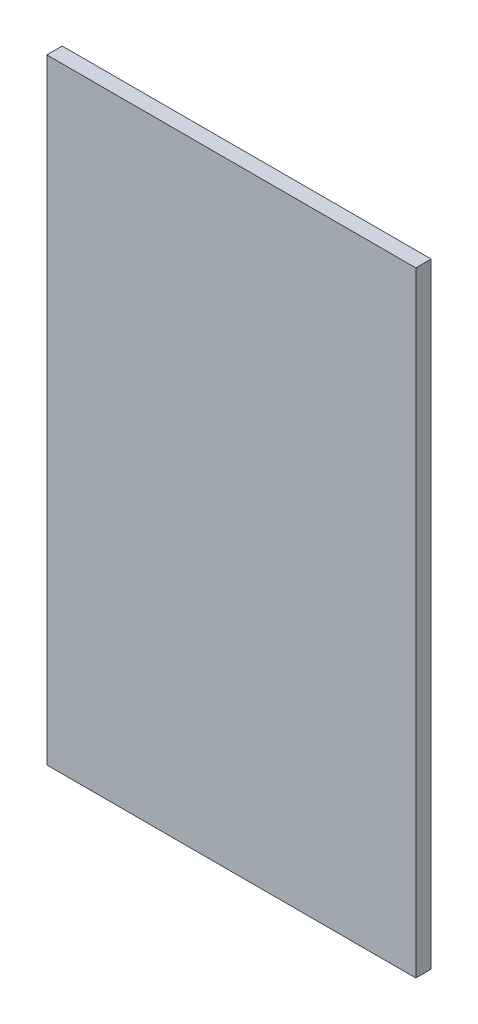
ISO-10303-21;
HEADER;
FILE_DESCRIPTION(('STEP AP214'),'2;1');
FILE_NAME('part.step','',(''),(''),'','','');
FILE_SCHEMA(('AUTOMOTIVE_DESIGN { 1 0 10303 214 1 1 1 1 }'));
ENDSEC;
DATA;
#1=APPLICATION_CONTEXT('core data for automotive mechanical design processes');
#2=APPLICATION_PROTOCOL_DEFINITION('international standard','automotive_design',2000,#1);
#3=PRODUCT_CONTEXT('',#1,'mechanical');
#4=PRODUCT('Part','Part','',(#3));
#5=PRODUCT_RELATED_PRODUCT_CATEGORY('part','',(#4));
#6=PRODUCT_DEFINITION_FORMATION('','',#4);
#7=PRODUCT_DEFINITION_CONTEXT('part definition',#1,'design');
#8=PRODUCT_DEFINITION('design','',#6,#7);
#9=PRODUCT_DEFINITION_SHAPE('','',#8);
#10=(LENGTH_UNIT() NAMED_UNIT(*) SI_UNIT(.MILLI.,.METRE.));
#11=(NAMED_UNIT(*) PLANE_ANGLE_UNIT() SI_UNIT($,.RADIAN.));
#12=(NAMED_UNIT(*) SI_UNIT($,.STERADIAN.) SOLID_ANGLE_UNIT());
#13=UNCERTAINTY_MEASURE_WITH_UNIT(LENGTH_MEASURE(1.E-05),#10,'distance_accuracy_value','');
#14=(GEOMETRIC_REPRESENTATION_CONTEXT(3) GLOBAL_UNCERTAINTY_ASSIGNED_CONTEXT((#13)) GLOBAL_UNIT_ASSIGNED_CONTEXT((#10,
#11,#12)) REPRESENTATION_CONTEXT('',''));
#15=CARTESIAN_POINT('',(0.,0.,0.));
#16=DIRECTION('',(0.,0.,1.));
#17=DIRECTION('',(1.,0.,0.));
#18=AXIS2_PLACEMENT_3D('',#15,#16,#17);
#19=CARTESIAN_POINT('',(-249.053505065089,-159.5414288217,6.35));
#20=DIRECTION('',(1.,0.,0.));
#21=DIRECTION('',(0.,0.,-1.));
#22=AXIS2_PLACEMENT_3D('',#19,#20,#21);
#23=PLANE('',#22);
#24=DIRECTION('',(0.,-1.,0.));
#25=VECTOR('',#24,1.);
#26=CARTESIAN_POINT('',(-249.053505065089,-159.5414288217,0.));
#27=LINE('',#26,#25);
#28=CARTESIAN_POINT('',(-249.053505065089,94.4585711783003,0.));
#29=VERTEX_POINT('',#28);
#30=CARTESIAN_POINT('',(-249.053505065089,-159.5414288217,0.));
#31=VERTEX_POINT('',#30);
#32=EDGE_CURVE('E96',#29,#31,#27,.T.);
#33=ORIENTED_EDGE('',*,*,#32,.T.);
#34=DIRECTION('',(0.,0.,-1.));
#35=VECTOR('',#34,1.);
#36=CARTESIAN_POINT('',(-249.053505065089,-159.5414288217,6.35));
#37=LINE('',#36,#35);
#38=CARTESIAN_POINT('',(-249.053505065089,-159.5414288217,6.35));
#39=VERTEX_POINT('',#38);
#40=EDGE_CURVE('E11',#39,#31,#37,.T.);
#41=ORIENTED_EDGE('',*,*,#40,.F.);
#42=DIRECTION('',(0.,-1.,0.));
#43=VECTOR('',#42,1.);
#44=CARTESIAN_POINT('',(-249.053505065089,-159.5414288217,6.35));
#45=LINE('',#44,#43);
#46=CARTESIAN_POINT('',(-249.053505065089,94.4585711783003,6.35));
#47=VERTEX_POINT('',#46);
#48=EDGE_CURVE('E84',#47,#39,#45,.T.);
#49=ORIENTED_EDGE('',*,*,#48,.F.);
#50=DIRECTION('',(0.,0.,-1.));
#51=VECTOR('',#50,1.);
#52=CARTESIAN_POINT('',(-249.053505065089,94.4585711783003,6.35));
#53=LINE('',#52,#51);
#54=EDGE_CURVE('E92',#47,#29,#53,.T.);
#55=ORIENTED_EDGE('',*,*,#54,.T.);
#56=EDGE_LOOP('',(#33,#41,#49,#55));
#57=FACE_BOUND('',#56,.T.);
#58=ADVANCED_FACE('F33',(#57),#23,.F.);
#59=CARTESIAN_POINT('',(-249.053505065089,-159.5414288217,6.35));
#60=DIRECTION('',(0.,1.,0.));
#61=DIRECTION('',(0.,0.,1.));
#62=AXIS2_PLACEMENT_3D('',#59,#60,#61);
#63=PLANE('',#62);
#64=DIRECTION('',(1.,0.,0.));
#65=VECTOR('',#64,1.);
#66=CARTESIAN_POINT('',(-249.053505065089,-159.5414288217,0.));
#67=LINE('',#66,#65);
#68=CARTESIAN_POINT('',(-96.6535050650888,-159.5414288217,0.));
#69=VERTEX_POINT('',#68);
#70=EDGE_CURVE('E88',#31,#69,#67,.T.);
#71=ORIENTED_EDGE('',*,*,#70,.T.);
#72=DIRECTION('',(0.,0.,-1.));
#73=VECTOR('',#72,1.);
#74=CARTESIAN_POINT('',(-96.6535050650888,-159.5414288217,6.35));
#75=LINE('',#74,#73);
#76=CARTESIAN_POINT('',(-96.6535050650888,-159.5414288217,6.35));
#77=VERTEX_POINT('',#76);
#78=EDGE_CURVE('E41',#77,#69,#75,.T.);
#79=ORIENTED_EDGE('',*,*,#78,.F.);
#80=DIRECTION('',(1.,0.,0.));
#81=VECTOR('',#80,1.);
#82=CARTESIAN_POINT('',(-249.053505065089,-159.5414288217,6.35));
#83=LINE('',#82,#81);
#84=EDGE_CURVE('E79',#39,#77,#83,.T.);
#85=ORIENTED_EDGE('',*,*,#84,.F.);
#86=ORIENTED_EDGE('',*,*,#40,.T.);
#87=EDGE_LOOP('',(#71,#79,#85,#86));
#88=FACE_BOUND('',#87,.T.);
#89=ADVANCED_FACE('F87',(#88),#63,.F.);
#90=CARTESIAN_POINT('',(-96.6535050650888,-159.5414288217,6.35));
#91=DIRECTION('',(-1.,0.,0.));
#92=DIRECTION('',(0.,0.,1.));
#93=AXIS2_PLACEMENT_3D('',#90,#91,#92);
#94=PLANE('',#93);
#95=DIRECTION('',(0.,1.,0.));
#96=VECTOR('',#95,1.);
#97=CARTESIAN_POINT('',(-96.6535050650888,-159.5414288217,0.));
#98=LINE('',#97,#96);
#99=CARTESIAN_POINT('',(-96.6535050650888,94.4585711783003,0.));
#100=VERTEX_POINT('',#99);
#101=EDGE_CURVE('E66',#69,#100,#98,.T.);
#102=ORIENTED_EDGE('',*,*,#101,.T.);
#103=DIRECTION('',(0.,0.,-1.));
#104=VECTOR('',#103,1.);
#105=CARTESIAN_POINT('',(-96.6535050650888,94.4585711783003,6.35));
#106=LINE('',#105,#104);
#107=CARTESIAN_POINT('',(-96.6535050650888,94.4585711783003,6.35));
#108=VERTEX_POINT('',#107);
#109=EDGE_CURVE('E89',#108,#100,#106,.T.);
#110=ORIENTED_EDGE('',*,*,#109,.F.);
#111=DIRECTION('',(0.,1.,0.));
#112=VECTOR('',#111,1.);
#113=CARTESIAN_POINT('',(-96.6535050650888,-159.5414288217,6.35));
#114=LINE('',#113,#112);
#115=EDGE_CURVE('E82',#77,#108,#114,.T.);
#116=ORIENTED_EDGE('',*,*,#115,.F.);
#117=ORIENTED_EDGE('',*,*,#78,.T.);
#118=EDGE_LOOP('',(#102,#110,#116,#117));
#119=FACE_BOUND('',#118,.T.);
#120=ADVANCED_FACE('F90',(#119),#94,.F.);
#121=CARTESIAN_POINT('',(-249.053505065089,94.4585711783003,6.35));
#122=DIRECTION('',(0.,-1.,0.));
#123=DIRECTION('',(1.,0.,0.));
#124=AXIS2_PLACEMENT_3D('',#121,#122,#123);
#125=PLANE('',#124);
#126=DIRECTION('',(-1.,0.,0.));
#127=VECTOR('',#126,1.);
#128=CARTESIAN_POINT('',(-249.053505065089,94.4585711783003,0.));
#129=LINE('',#128,#127);
#130=EDGE_CURVE('E72',#100,#29,#129,.T.);
#131=ORIENTED_EDGE('',*,*,#130,.T.);
#132=ORIENTED_EDGE('',*,*,#54,.F.);
#133=DIRECTION('',(-1.,0.,0.));
#134=VECTOR('',#133,1.);
#135=CARTESIAN_POINT('',(-249.053505065089,94.4585711783003,6.35));
#136=LINE('',#135,#134);
#137=EDGE_CURVE('E49',#108,#47,#136,.T.);
#138=ORIENTED_EDGE('',*,*,#137,.F.);
#139=ORIENTED_EDGE('',*,*,#109,.T.);
#140=EDGE_LOOP('',(#131,#132,#138,#139));
#141=FACE_BOUND('',#140,.T.);
#142=ADVANCED_FACE('F103',(#141),#125,.F.);
#143=CARTESIAN_POINT('',(0.,0.,6.35));
#144=DIRECTION('',(0.,0.,-1.));
#145=DIRECTION('',(-1.,0.,0.));
#146=AXIS2_PLACEMENT_3D('',#143,#144,#145);
#147=PLANE('',#146);
#148=ORIENTED_EDGE('',*,*,#48,.T.);
#149=ORIENTED_EDGE('',*,*,#84,.T.);
#150=ORIENTED_EDGE('',*,*,#115,.T.);
#151=ORIENTED_EDGE('',*,*,#137,.T.);
#152=EDGE_LOOP('',(#148,#149,#150,#151));
#153=FACE_BOUND('',#152,.T.);
#154=ADVANCED_FACE('F80',(#153),#147,.F.);
#155=CARTESIAN_POINT('',(0.,0.,0.));
#156=DIRECTION('',(0.,0.,-1.));
#157=DIRECTION('',(-1.,0.,0.));
#158=AXIS2_PLACEMENT_3D('',#155,#156,#157);
#159=PLANE('',#158);
#160=ORIENTED_EDGE('',*,*,#32,.F.);
#161=ORIENTED_EDGE('',*,*,#130,.F.);
#162=ORIENTED_EDGE('',*,*,#101,.F.);
#163=ORIENTED_EDGE('',*,*,#70,.F.);
#164=EDGE_LOOP('',(#160,#161,#162,#163));
#165=FACE_BOUND('',#164,.T.);
#166=ADVANCED_FACE('F106',(#165),#159,.T.);
#167=CLOSED_SHELL('',(#58,#89,#120,#142,#154,#166));
#168=MANIFOLD_SOLID_BREP('B2',#167);
#169=ADVANCED_BREP_SHAPE_REPRESENTATION('',(#18,#168),#14);
#170=SHAPE_DEFINITION_REPRESENTATION(#9,#169);
ENDSEC;
END-ISO-10303-21;
